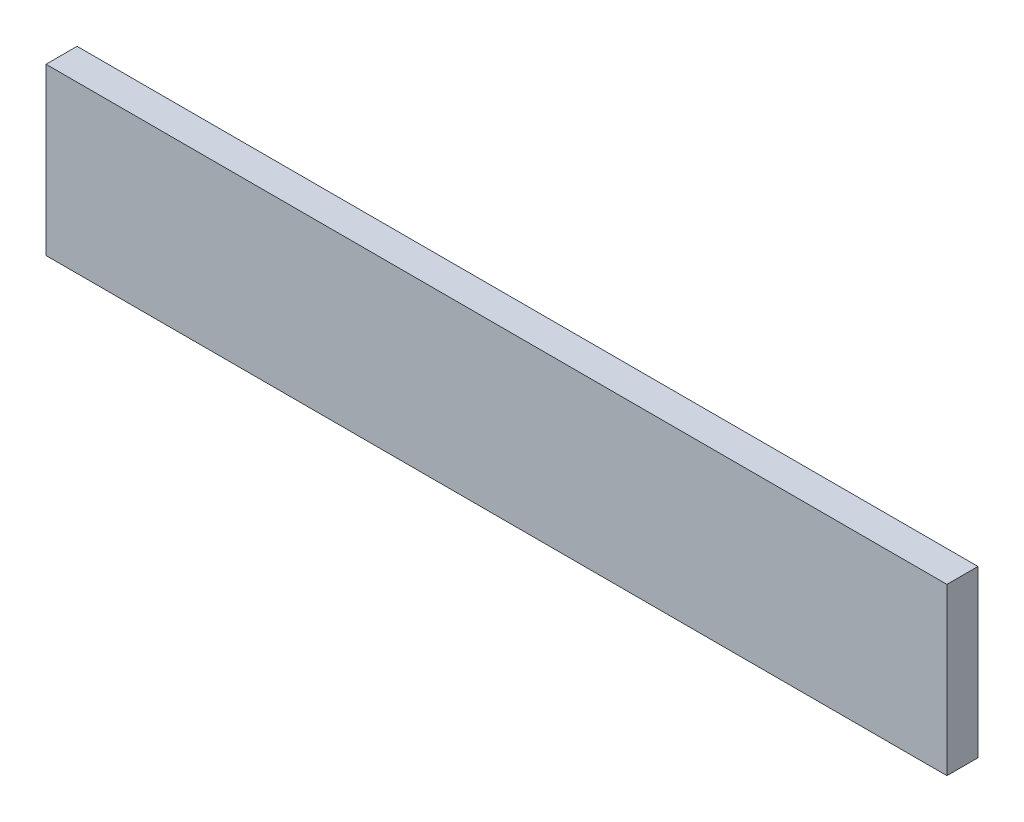
ISO-10303-21;
HEADER;
FILE_DESCRIPTION(('STEP AP214'),'2;1');
FILE_NAME('part.step','',(''),(''),'','','');
FILE_SCHEMA(('AUTOMOTIVE_DESIGN { 1 0 10303 214 1 1 1 1 }'));
ENDSEC;
DATA;
#1=APPLICATION_CONTEXT('core data for automotive mechanical design processes');
#2=APPLICATION_PROTOCOL_DEFINITION('international standard','automotive_design',2000,#1);
#3=PRODUCT_CONTEXT('',#1,'mechanical');
#4=PRODUCT('Part','Part','',(#3));
#5=PRODUCT_RELATED_PRODUCT_CATEGORY('part','',(#4));
#6=PRODUCT_DEFINITION_FORMATION('','',#4);
#7=PRODUCT_DEFINITION_CONTEXT('part definition',#1,'design');
#8=PRODUCT_DEFINITION('design','',#6,#7);
#9=PRODUCT_DEFINITION_SHAPE('','',#8);
#10=(LENGTH_UNIT() NAMED_UNIT(*) SI_UNIT(.MILLI.,.METRE.));
#11=(NAMED_UNIT(*) PLANE_ANGLE_UNIT() SI_UNIT($,.RADIAN.));
#12=(NAMED_UNIT(*) SI_UNIT($,.STERADIAN.) SOLID_ANGLE_UNIT());
#13=UNCERTAINTY_MEASURE_WITH_UNIT(LENGTH_MEASURE(1.E-05),#10,'distance_accuracy_value','');
#14=(GEOMETRIC_REPRESENTATION_CONTEXT(3) GLOBAL_UNCERTAINTY_ASSIGNED_CONTEXT((#13)) GLOBAL_UNIT_ASSIGNED_CONTEXT((#10,
#11,#12)) REPRESENTATION_CONTEXT('',''));
#15=CARTESIAN_POINT('',(0.,0.,0.));
#16=DIRECTION('',(0.,0.,1.));
#17=DIRECTION('',(1.,0.,0.));
#18=AXIS2_PLACEMENT_3D('',#15,#16,#17);
#19=CARTESIAN_POINT('',(0.,8.,0.));
#20=DIRECTION('',(1.,0.,0.));
#21=DIRECTION('',(0.,0.,-1.));
#22=AXIS2_PLACEMENT_3D('',#19,#20,#21);
#23=PLANE('',#22);
#24=DIRECTION('',(0.,0.,1.));
#25=VECTOR('',#24,1.);
#26=CARTESIAN_POINT('',(0.,0.,0.));
#27=LINE('',#26,#25);
#28=CARTESIAN_POINT('',(0.,0.,-1.5));
#29=VERTEX_POINT('',#28);
#30=CARTESIAN_POINT('',(0.,0.,0.));
#31=VERTEX_POINT('',#30);
#32=EDGE_CURVE('E128',#29,#31,#27,.T.);
#33=ORIENTED_EDGE('',*,*,#32,.T.);
#34=DIRECTION('',(0.,-1.,0.));
#35=VECTOR('',#34,1.);
#36=CARTESIAN_POINT('',(0.,8.,0.));
#37=LINE('',#36,#35);
#38=CARTESIAN_POINT('',(0.,8.,0.));
#39=VERTEX_POINT('',#38);
#40=EDGE_CURVE('E11',#39,#31,#37,.T.);
#41=ORIENTED_EDGE('',*,*,#40,.F.);
#42=DIRECTION('',(0.,0.,1.));
#43=VECTOR('',#42,1.);
#44=CARTESIAN_POINT('',(0.,8.,0.));
#45=LINE('',#44,#43);
#46=CARTESIAN_POINT('',(0.,8.,-1.5));
#47=VERTEX_POINT('',#46);
#48=EDGE_CURVE('E110',#47,#39,#45,.T.);
#49=ORIENTED_EDGE('',*,*,#48,.F.);
#50=DIRECTION('',(0.,-1.,0.));
#51=VECTOR('',#50,1.);
#52=CARTESIAN_POINT('',(0.,8.,-1.5));
#53=LINE('',#52,#51);
#54=EDGE_CURVE('E124',#47,#29,#53,.T.);
#55=ORIENTED_EDGE('',*,*,#54,.T.);
#56=EDGE_LOOP('',(#33,#41,#49,#55));
#57=FACE_BOUND('',#56,.T.);
#58=ADVANCED_FACE('F50',(#57),#23,.F.);
#59=CARTESIAN_POINT('',(0.,8.,0.));
#60=DIRECTION('',(0.,0.,-1.));
#61=DIRECTION('',(-1.,0.,0.));
#62=AXIS2_PLACEMENT_3D('',#59,#60,#61);
#63=PLANE('',#62);
#64=DIRECTION('',(1.,0.,0.));
#65=VECTOR('',#64,1.);
#66=CARTESIAN_POINT('',(0.,0.,0.));
#67=LINE('',#66,#65);
#68=CARTESIAN_POINT('',(43.5,0.,0.));
#69=VERTEX_POINT('',#68);
#70=EDGE_CURVE('E115',#31,#69,#67,.T.);
#71=ORIENTED_EDGE('',*,*,#70,.T.);
#72=DIRECTION('',(0.,-1.,0.));
#73=VECTOR('',#72,1.);
#74=CARTESIAN_POINT('',(43.5,8.,0.));
#75=LINE('',#74,#73);
#76=CARTESIAN_POINT('',(43.5,8.,0.));
#77=VERTEX_POINT('',#76);
#78=EDGE_CURVE('E59',#77,#69,#75,.T.);
#79=ORIENTED_EDGE('',*,*,#78,.F.);
#80=DIRECTION('',(1.,0.,0.));
#81=VECTOR('',#80,1.);
#82=CARTESIAN_POINT('',(0.,8.,0.));
#83=LINE('',#82,#81);
#84=EDGE_CURVE('E105',#39,#77,#83,.T.);
#85=ORIENTED_EDGE('',*,*,#84,.F.);
#86=ORIENTED_EDGE('',*,*,#40,.T.);
#87=EDGE_LOOP('',(#71,#79,#85,#86));
#88=FACE_BOUND('',#87,.T.);
#89=ADVANCED_FACE('F114',(#88),#63,.F.);
#90=CARTESIAN_POINT('',(43.5,8.,0.));
#91=DIRECTION('',(-1.,0.,0.));
#92=DIRECTION('',(0.,0.,1.));
#93=AXIS2_PLACEMENT_3D('',#90,#91,#92);
#94=PLANE('',#93);
#95=DIRECTION('',(0.,0.,-1.));
#96=VECTOR('',#95,1.);
#97=CARTESIAN_POINT('',(43.5,0.,0.));
#98=LINE('',#97,#96);
#99=CARTESIAN_POINT('',(43.5,0.,-1.5));
#100=VERTEX_POINT('',#99);
#101=EDGE_CURVE('E91',#69,#100,#98,.T.);
#102=ORIENTED_EDGE('',*,*,#101,.T.);
#103=DIRECTION('',(0.,-1.,0.));
#104=VECTOR('',#103,1.);
#105=CARTESIAN_POINT('',(43.5,8.,-1.5));
#106=LINE('',#105,#104);
#107=CARTESIAN_POINT('',(43.5,8.,-1.5));
#108=VERTEX_POINT('',#107);
#109=EDGE_CURVE('E117',#108,#100,#106,.T.);
#110=ORIENTED_EDGE('',*,*,#109,.F.);
#111=DIRECTION('',(0.,0.,-1.));
#112=VECTOR('',#111,1.);
#113=CARTESIAN_POINT('',(43.5,8.,0.));
#114=LINE('',#113,#112);
#115=EDGE_CURVE('E108',#77,#108,#114,.T.);
#116=ORIENTED_EDGE('',*,*,#115,.F.);
#117=ORIENTED_EDGE('',*,*,#78,.T.);
#118=EDGE_LOOP('',(#102,#110,#116,#117));
#119=FACE_BOUND('',#118,.T.);
#120=ADVANCED_FACE('F118',(#119),#94,.F.);
#121=CARTESIAN_POINT('',(0.,8.,-1.5));
#122=DIRECTION('',(0.,0.,1.));
#123=DIRECTION('',(1.,0.,0.));
#124=AXIS2_PLACEMENT_3D('',#121,#122,#123);
#125=PLANE('',#124);
#126=DIRECTION('',(-1.,0.,0.));
#127=VECTOR('',#126,1.);
#128=CARTESIAN_POINT('',(0.,0.,-1.5));
#129=LINE('',#128,#127);
#130=EDGE_CURVE('E98',#100,#29,#129,.T.);
#131=ORIENTED_EDGE('',*,*,#130,.T.);
#132=ORIENTED_EDGE('',*,*,#54,.F.);
#133=DIRECTION('',(-1.,0.,0.));
#134=VECTOR('',#133,1.);
#135=CARTESIAN_POINT('',(0.,8.,-1.5));
#136=LINE('',#135,#134);
#137=EDGE_CURVE('E70',#108,#47,#136,.T.);
#138=ORIENTED_EDGE('',*,*,#137,.F.);
#139=ORIENTED_EDGE('',*,*,#109,.T.);
#140=EDGE_LOOP('',(#131,#132,#138,#139));
#141=FACE_BOUND('',#140,.T.);
#142=ADVANCED_FACE('F139',(#141),#125,.F.);
#143=CARTESIAN_POINT('',(0.,8.,0.));
#144=DIRECTION('',(0.,-1.,0.));
#145=DIRECTION('',(0.,0.,-1.));
#146=AXIS2_PLACEMENT_3D('',#143,#144,#145);
#147=PLANE('',#146);
#148=ORIENTED_EDGE('',*,*,#48,.T.);
#149=ORIENTED_EDGE('',*,*,#84,.T.);
#150=ORIENTED_EDGE('',*,*,#115,.T.);
#151=ORIENTED_EDGE('',*,*,#137,.T.);
#152=EDGE_LOOP('',(#148,#149,#150,#151));
#153=FACE_BOUND('',#152,.T.);
#154=ADVANCED_FACE('F106',(#153),#147,.F.);
#155=CARTESIAN_POINT('',(0.,0.,0.));
#156=DIRECTION('',(0.,-1.,0.));
#157=DIRECTION('',(0.,0.,-1.));
#158=AXIS2_PLACEMENT_3D('',#155,#156,#157);
#159=PLANE('',#158);
#160=ORIENTED_EDGE('',*,*,#32,.F.);
#161=ORIENTED_EDGE('',*,*,#130,.F.);
#162=ORIENTED_EDGE('',*,*,#101,.F.);
#163=ORIENTED_EDGE('',*,*,#70,.F.);
#164=EDGE_LOOP('',(#160,#161,#162,#163));
#165=FACE_BOUND('',#164,.T.);
#166=ADVANCED_FACE('F142',(#165),#159,.T.);
#167=CLOSED_SHELL('',(#58,#89,#120,#142,#154,#166));
#168=MANIFOLD_SOLID_BREP('B2',#167);
#169=ADVANCED_BREP_SHAPE_REPRESENTATION('',(#18,#168),#14);
#170=SHAPE_DEFINITION_REPRESENTATION(#9,#169);
ENDSEC;
END-ISO-10303-21;
